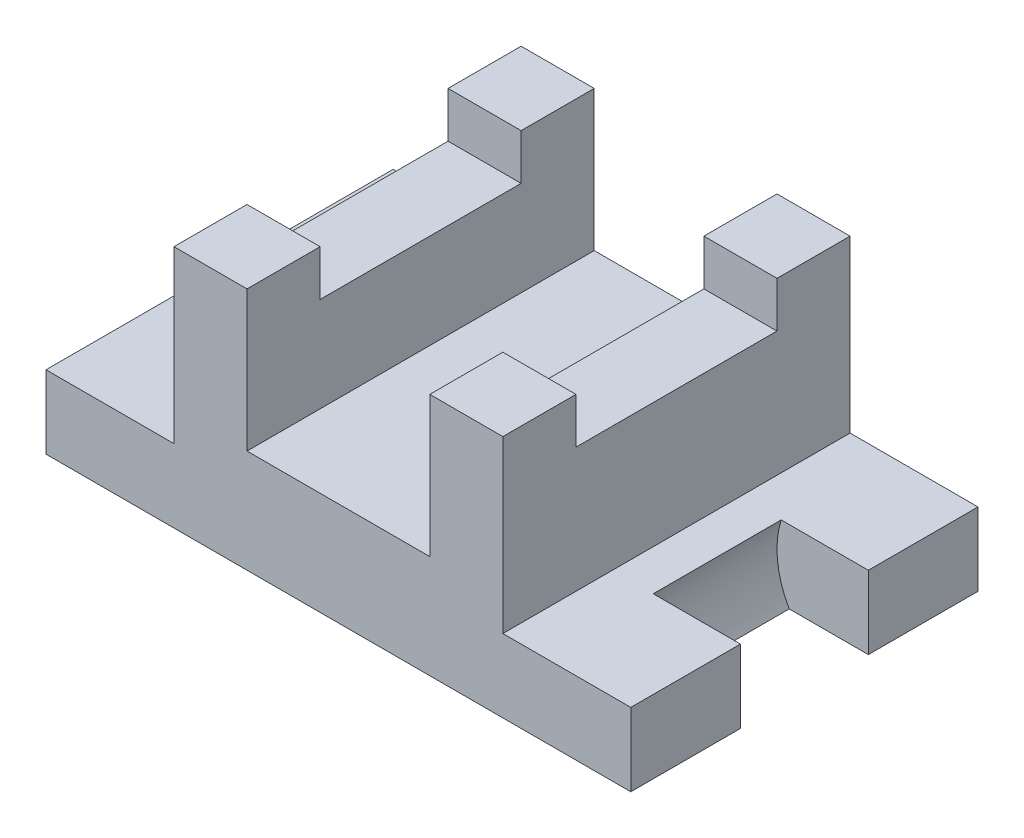
ISO-10303-21;
HEADER;
FILE_DESCRIPTION(('STEP AP214'),'2;1');
FILE_NAME('part.step','',(''),(''),'','','');
FILE_SCHEMA(('AUTOMOTIVE_DESIGN { 1 0 10303 214 1 1 1 1 }'));
ENDSEC;
DATA;
#1=APPLICATION_CONTEXT('core data for automotive mechanical design processes');
#2=APPLICATION_PROTOCOL_DEFINITION('international standard','automotive_design',2000,#1);
#3=PRODUCT_CONTEXT('',#1,'mechanical');
#4=PRODUCT('Part','Part','',(#3));
#5=PRODUCT_RELATED_PRODUCT_CATEGORY('part','',(#4));
#6=PRODUCT_DEFINITION_FORMATION('','',#4);
#7=PRODUCT_DEFINITION_CONTEXT('part definition',#1,'design');
#8=PRODUCT_DEFINITION('design','',#6,#7);
#9=PRODUCT_DEFINITION_SHAPE('','',#8);
#10=(LENGTH_UNIT() NAMED_UNIT(*) SI_UNIT(.MILLI.,.METRE.));
#11=(NAMED_UNIT(*) PLANE_ANGLE_UNIT() SI_UNIT($,.RADIAN.));
#12=(NAMED_UNIT(*) SI_UNIT($,.STERADIAN.) SOLID_ANGLE_UNIT());
#13=UNCERTAINTY_MEASURE_WITH_UNIT(LENGTH_MEASURE(1.E-05),#10,'distance_accuracy_value','');
#14=(GEOMETRIC_REPRESENTATION_CONTEXT(3) GLOBAL_UNCERTAINTY_ASSIGNED_CONTEXT((#13)) GLOBAL_UNIT_ASSIGNED_CONTEXT((#10,
#11,#12)) REPRESENTATION_CONTEXT('',''));
#15=CARTESIAN_POINT('',(0.,0.,0.));
#16=DIRECTION('',(0.,0.,1.));
#17=DIRECTION('',(1.,0.,0.));
#18=AXIS2_PLACEMENT_3D('',#15,#16,#17);
#19=CARTESIAN_POINT('',(-17.9522074080151,14.406673628607,38.));
#20=DIRECTION('',(0.,1.,0.));
#21=DIRECTION('',(0.,0.,1.));
#22=AXIS2_PLACEMENT_3D('',#19,#20,#21);
#23=PLANE('',#22);
#24=DIRECTION('',(1.,0.,0.));
#25=VECTOR('',#24,1.);
#26=CARTESIAN_POINT('',(-17.9522074080151,14.406673628607,12.));
#27=LINE('',#26,#25);
#28=CARTESIAN_POINT('',(37.3875385541405,14.406673628607,12.));
#29=VERTEX_POINT('',#28);
#30=CARTESIAN_POINT('',(46.0477925919849,14.406673628607,12.));
#31=VERTEX_POINT('',#30);
#32=EDGE_CURVE('E211',#29,#31,#27,.T.);
#33=ORIENTED_EDGE('',*,*,#32,.F.);
#34=DIRECTION('',(0.,0.,-1.));
#35=VECTOR('',#34,1.);
#36=CARTESIAN_POINT('',(37.3875385541405,14.406673628607,12.));
#37=LINE('',#36,#35);
#38=CARTESIAN_POINT('',(37.3875385541405,14.406673628607,26.));
#39=VERTEX_POINT('',#38);
#40=EDGE_CURVE('E199',#29,#39,#37,.F.);
#41=ORIENTED_EDGE('',*,*,#40,.T.);
#42=DIRECTION('',(1.,0.,0.));
#43=VECTOR('',#42,1.);
#44=CARTESIAN_POINT('',(-17.9522074080151,14.406673628607,26.));
#45=LINE('',#44,#43);
#46=CARTESIAN_POINT('',(46.0477925919849,14.406673628607,26.));
#47=VERTEX_POINT('',#46);
#48=EDGE_CURVE('E191',#39,#47,#45,.T.);
#49=ORIENTED_EDGE('',*,*,#48,.T.);
#50=DIRECTION('',(0.,0.,-1.));
#51=VECTOR('',#50,1.);
#52=CARTESIAN_POINT('',(46.0477925919849,14.406673628607,38.));
#53=LINE('',#52,#51);
#54=CARTESIAN_POINT('',(46.0477925919849,14.406673628607,38.));
#55=VERTEX_POINT('',#54);
#56=EDGE_CURVE('E338',#55,#47,#53,.T.);
#57=ORIENTED_EDGE('',*,*,#56,.F.);
#58=DIRECTION('',(1.,0.,0.));
#59=VECTOR('',#58,1.);
#60=CARTESIAN_POINT('',(-17.9522074080151,14.406673628607,38.));
#61=LINE('',#60,#59);
#62=CARTESIAN_POINT('',(-17.9522074080151,14.406673628607,38.));
#63=VERTEX_POINT('',#62);
#64=EDGE_CURVE('E274',#63,#55,#61,.T.);
#65=ORIENTED_EDGE('',*,*,#64,.F.);
#66=DIRECTION('',(0.,0.,-1.));
#67=VECTOR('',#66,1.);
#68=CARTESIAN_POINT('',(-17.9522074080151,14.406673628607,38.));
#69=LINE('',#68,#67);
#70=CARTESIAN_POINT('',(-17.9522074080151,14.406673628607,0.));
#71=VERTEX_POINT('',#70);
#72=EDGE_CURVE('E340',#63,#71,#69,.T.);
#73=ORIENTED_EDGE('',*,*,#72,.T.);
#74=DIRECTION('',(1.,0.,0.));
#75=VECTOR('',#74,1.);
#76=CARTESIAN_POINT('',(-17.9522074080151,14.406673628607,0.));
#77=LINE('',#76,#75);
#78=CARTESIAN_POINT('',(46.0477925919849,14.406673628607,0.));
#79=VERTEX_POINT('',#78);
#80=EDGE_CURVE('E300',#71,#79,#77,.T.);
#81=ORIENTED_EDGE('',*,*,#80,.T.);
#82=EDGE_CURVE('E337',#31,#79,#53,.T.);
#83=ORIENTED_EDGE('',*,*,#82,.F.);
#84=EDGE_LOOP('',(#33,#41,#49,#57,#65,#73,#81,#83));
#85=FACE_BOUND('',#84,.T.);
#86=ADVANCED_FACE('F33',(#85),#23,.F.);
#87=CARTESIAN_POINT('',(46.0477925919849,14.406673628607,38.));
#88=DIRECTION('',(-1.,0.,0.));
#89=DIRECTION('',(0.,0.,1.));
#90=AXIS2_PLACEMENT_3D('',#87,#88,#89);
#91=PLANE('',#90);
#92=DIRECTION('',(0.,1.,0.));
#93=VECTOR('',#92,1.);
#94=CARTESIAN_POINT('',(46.0477925919849,14.406673628607,12.));
#95=LINE('',#94,#93);
#96=CARTESIAN_POINT('',(46.0477925919849,22.406673628607,12.));
#97=VERTEX_POINT('',#96);
#98=EDGE_CURVE('E212',#31,#97,#95,.T.);
#99=ORIENTED_EDGE('',*,*,#98,.F.);
#100=ORIENTED_EDGE('',*,*,#82,.T.);
#101=DIRECTION('',(0.,1.,0.));
#102=VECTOR('',#101,1.);
#103=CARTESIAN_POINT('',(46.0477925919849,14.406673628607,0.));
#104=LINE('',#103,#102);
#105=CARTESIAN_POINT('',(46.0477925919849,22.406673628607,0.));
#106=VERTEX_POINT('',#105);
#107=EDGE_CURVE('E303',#79,#106,#104,.T.);
#108=ORIENTED_EDGE('',*,*,#107,.T.);
#109=DIRECTION('',(0.,0.,-1.));
#110=VECTOR('',#109,1.);
#111=CARTESIAN_POINT('',(46.0477925919849,22.406673628607,38.));
#112=LINE('',#111,#110);
#113=EDGE_CURVE('E333',#97,#106,#112,.T.);
#114=ORIENTED_EDGE('',*,*,#113,.F.);
#115=EDGE_LOOP('',(#99,#100,#108,#114));
#116=FACE_BOUND('',#115,.T.);
#117=ADVANCED_FACE('F381',(#116),#91,.F.);
#118=CARTESIAN_POINT('',(46.0477925919849,22.406673628607,38.));
#119=DIRECTION('',(0.,-1.,0.));
#120=DIRECTION('',(0.,0.,-1.));
#121=AXIS2_PLACEMENT_3D('',#118,#119,#120);
#122=PLANE('',#121);
#123=DIRECTION('',(-1.,0.,0.));
#124=VECTOR('',#123,1.);
#125=CARTESIAN_POINT('',(46.0477925919849,22.406673628607,12.));
#126=LINE('',#125,#124);
#127=CARTESIAN_POINT('',(36.5084005778155,22.406673628607,12.));
#128=VERTEX_POINT('',#127);
#129=EDGE_CURVE('E11',#97,#128,#126,.T.);
#130=ORIENTED_EDGE('',*,*,#129,.F.);
#131=ORIENTED_EDGE('',*,*,#113,.T.);
#132=DIRECTION('',(-1.,0.,0.));
#133=VECTOR('',#132,1.);
#134=CARTESIAN_POINT('',(46.0477925919849,22.406673628607,0.));
#135=LINE('',#134,#133);
#136=CARTESIAN_POINT('',(32.0477925919849,22.406673628607,0.));
#137=VERTEX_POINT('',#136);
#138=EDGE_CURVE('E306',#106,#137,#135,.T.);
#139=ORIENTED_EDGE('',*,*,#138,.T.);
#140=DIRECTION('',(0.,0.,-1.));
#141=VECTOR('',#140,1.);
#142=CARTESIAN_POINT('',(32.0477925919849,22.406673628607,38.));
#143=LINE('',#142,#141);
#144=CARTESIAN_POINT('',(32.0477925919849,22.406673628607,38.));
#145=VERTEX_POINT('',#144);
#146=EDGE_CURVE('E330',#145,#137,#143,.T.);
#147=ORIENTED_EDGE('',*,*,#146,.F.);
#148=DIRECTION('',(-1.,0.,0.));
#149=VECTOR('',#148,1.);
#150=CARTESIAN_POINT('',(46.0477925919849,22.406673628607,38.));
#151=LINE('',#150,#149);
#152=CARTESIAN_POINT('',(46.0477925919849,22.406673628607,38.));
#153=VERTEX_POINT('',#152);
#154=EDGE_CURVE('E278',#153,#145,#151,.T.);
#155=ORIENTED_EDGE('',*,*,#154,.F.);
#156=CARTESIAN_POINT('',(46.0477925919849,22.406673628607,26.));
#157=VERTEX_POINT('',#156);
#158=EDGE_CURVE('E334',#153,#157,#112,.T.);
#159=ORIENTED_EDGE('',*,*,#158,.T.);
#160=DIRECTION('',(-1.,0.,0.));
#161=VECTOR('',#160,1.);
#162=CARTESIAN_POINT('',(46.0477925919849,22.406673628607,26.));
#163=LINE('',#162,#161);
#164=CARTESIAN_POINT('',(36.5084005778155,22.406673628607,26.));
#165=VERTEX_POINT('',#164);
#166=EDGE_CURVE('E366',#157,#165,#163,.T.);
#167=ORIENTED_EDGE('',*,*,#166,.T.);
#168=DIRECTION('',(0.,0.,-1.));
#169=VECTOR('',#168,1.);
#170=CARTESIAN_POINT('',(36.5084005778155,22.406673628607,12.));
#171=LINE('',#170,#169);
#172=EDGE_CURVE('E41',#165,#128,#171,.T.);
#173=ORIENTED_EDGE('',*,*,#172,.T.);
#174=EDGE_LOOP('',(#130,#131,#139,#147,#155,#159,#167,#173));
#175=FACE_BOUND('',#174,.T.);
#176=ADVANCED_FACE('F369',(#175),#122,.F.);
#177=CARTESIAN_POINT('',(4.04779259198493,41.0733402952737,38.));
#178=DIRECTION('',(0.,-1.,0.));
#179=DIRECTION('',(0.,0.,-1.));
#180=AXIS2_PLACEMENT_3D('',#177,#178,#179);
#181=PLANE('',#180);
#182=DIRECTION('',(0.,0.,-1.));
#183=VECTOR('',#182,1.);
#184=CARTESIAN_POINT('',(-3.95220740801507,41.0733402952737,38.));
#185=LINE('',#184,#183);
#186=CARTESIAN_POINT('',(-3.95220740801507,41.0733402952737,8.));
#187=VERTEX_POINT('',#186);
#188=CARTESIAN_POINT('',(-3.95220740801507,41.0733402952737,0.));
#189=VERTEX_POINT('',#188);
#190=EDGE_CURVE('E349',#187,#189,#185,.T.);
#191=ORIENTED_EDGE('',*,*,#190,.F.);
#192=DIRECTION('',(1.,0.,0.));
#193=VECTOR('',#192,1.);
#194=CARTESIAN_POINT('',(4.04779259198493,41.0733402952737,8.));
#195=LINE('',#194,#193);
#196=CARTESIAN_POINT('',(4.04779259198493,41.0733402952737,8.));
#197=VERTEX_POINT('',#196);
#198=EDGE_CURVE('E255',#187,#197,#195,.T.);
#199=ORIENTED_EDGE('',*,*,#198,.T.);
#200=DIRECTION('',(0.,0.,-1.));
#201=VECTOR('',#200,1.);
#202=CARTESIAN_POINT('',(4.04779259198493,41.0733402952737,38.));
#203=LINE('',#202,#201);
#204=CARTESIAN_POINT('',(4.04779259198493,41.0733402952737,0.));
#205=VERTEX_POINT('',#204);
#206=EDGE_CURVE('E353',#197,#205,#203,.T.);
#207=ORIENTED_EDGE('',*,*,#206,.T.);
#208=DIRECTION('',(-1.,0.,0.));
#209=VECTOR('',#208,1.);
#210=CARTESIAN_POINT('',(4.04779259198493,41.0733402952737,0.));
#211=LINE('',#210,#209);
#212=EDGE_CURVE('E291',#205,#189,#211,.T.);
#213=ORIENTED_EDGE('',*,*,#212,.T.);
#214=EDGE_LOOP('',(#191,#199,#207,#213));
#215=FACE_BOUND('',#214,.T.);
#216=ADVANCED_FACE('F420',(#215),#181,.F.);
#217=CARTESIAN_POINT('',(32.0477925919849,41.0733402952737,38.));
#218=DIRECTION('',(0.,-1.,0.));
#219=DIRECTION('',(0.,0.,-1.));
#220=AXIS2_PLACEMENT_3D('',#217,#218,#219);
#221=PLANE('',#220);
#222=DIRECTION('',(0.,0.,-1.));
#223=VECTOR('',#222,1.);
#224=CARTESIAN_POINT('',(24.0477925919849,41.0733402952737,38.));
#225=LINE('',#224,#223);
#226=CARTESIAN_POINT('',(24.0477925919849,41.0733402952737,8.));
#227=VERTEX_POINT('',#226);
#228=CARTESIAN_POINT('',(24.0477925919849,41.0733402952737,0.));
#229=VERTEX_POINT('',#228);
#230=EDGE_CURVE('E322',#227,#229,#225,.T.);
#231=ORIENTED_EDGE('',*,*,#230,.F.);
#232=DIRECTION('',(1.,0.,0.));
#233=VECTOR('',#232,1.);
#234=CARTESIAN_POINT('',(32.0477925919849,41.0733402952737,8.));
#235=LINE('',#234,#233);
#236=CARTESIAN_POINT('',(32.0477925919849,41.0733402952737,8.));
#237=VERTEX_POINT('',#236);
#238=EDGE_CURVE('E249',#227,#237,#235,.T.);
#239=ORIENTED_EDGE('',*,*,#238,.T.);
#240=DIRECTION('',(0.,0.,-1.));
#241=VECTOR('',#240,1.);
#242=CARTESIAN_POINT('',(32.0477925919849,41.0733402952737,38.));
#243=LINE('',#242,#241);
#244=CARTESIAN_POINT('',(32.0477925919849,41.0733402952737,0.));
#245=VERTEX_POINT('',#244);
#246=EDGE_CURVE('E326',#237,#245,#243,.T.);
#247=ORIENTED_EDGE('',*,*,#246,.T.);
#248=DIRECTION('',(-1.,0.,0.));
#249=VECTOR('',#248,1.);
#250=CARTESIAN_POINT('',(32.0477925919849,41.0733402952737,0.));
#251=LINE('',#250,#249);
#252=EDGE_CURVE('E311',#245,#229,#251,.T.);
#253=ORIENTED_EDGE('',*,*,#252,.T.);
#254=EDGE_LOOP('',(#231,#239,#247,#253));
#255=FACE_BOUND('',#254,.T.);
#256=ADVANCED_FACE('F437',(#255),#221,.F.);
#257=CARTESIAN_POINT('',(4.04779259198493,41.0733402952737,38.));
#258=DIRECTION('',(-1.,0.,0.));
#259=DIRECTION('',(0.,0.,1.));
#260=AXIS2_PLACEMENT_3D('',#257,#258,#259);
#261=PLANE('',#260);
#262=ORIENTED_EDGE('',*,*,#206,.F.);
#263=DIRECTION('',(0.,-1.,0.));
#264=VECTOR('',#263,1.);
#265=CARTESIAN_POINT('',(4.04779259198493,41.0733402952737,8.));
#266=LINE('',#265,#264);
#267=CARTESIAN_POINT('',(4.04779259198493,36.0733402952737,8.));
#268=VERTEX_POINT('',#267);
#269=EDGE_CURVE('E258',#197,#268,#266,.T.);
#270=ORIENTED_EDGE('',*,*,#269,.T.);
#271=DIRECTION('',(0.,0.,1.));
#272=VECTOR('',#271,1.);
#273=CARTESIAN_POINT('',(4.04779259198493,36.0733402952737,38.));
#274=LINE('',#273,#272);
#275=CARTESIAN_POINT('',(4.04779259198493,36.0733402952737,30.));
#276=VERTEX_POINT('',#275);
#277=EDGE_CURVE('E246',#268,#276,#274,.T.);
#278=ORIENTED_EDGE('',*,*,#277,.T.);
#279=DIRECTION('',(0.,1.,0.));
#280=VECTOR('',#279,1.);
#281=CARTESIAN_POINT('',(4.04779259198493,41.0733402952737,30.));
#282=LINE('',#281,#280);
#283=CARTESIAN_POINT('',(4.04779259198493,41.0733402952737,30.));
#284=VERTEX_POINT('',#283);
#285=EDGE_CURVE('E240',#276,#284,#282,.T.);
#286=ORIENTED_EDGE('',*,*,#285,.T.);
#287=CARTESIAN_POINT('',(4.04779259198493,41.0733402952737,38.));
#288=VERTEX_POINT('',#287);
#289=EDGE_CURVE('E354',#288,#284,#203,.T.);
#290=ORIENTED_EDGE('',*,*,#289,.F.);
#291=DIRECTION('',(0.,1.,0.));
#292=VECTOR('',#291,1.);
#293=CARTESIAN_POINT('',(4.04779259198493,41.0733402952737,38.));
#294=LINE('',#293,#292);
#295=CARTESIAN_POINT('',(4.04779259198493,25.7007912756659,38.));
#296=VERTEX_POINT('',#295);
#297=EDGE_CURVE('E262',#296,#288,#294,.T.);
#298=ORIENTED_EDGE('',*,*,#297,.F.);
#299=DIRECTION('',(0.,0.,-1.));
#300=VECTOR('',#299,1.);
#301=CARTESIAN_POINT('',(4.04779259198493,25.7007912756659,38.));
#302=LINE('',#301,#300);
#303=CARTESIAN_POINT('',(4.04779259198493,25.7007912756659,0.));
#304=VERTEX_POINT('',#303);
#305=EDGE_CURVE('E288',#296,#304,#302,.T.);
#306=ORIENTED_EDGE('',*,*,#305,.T.);
#307=DIRECTION('',(0.,1.,0.));
#308=VECTOR('',#307,1.);
#309=CARTESIAN_POINT('',(4.04779259198493,41.0733402952737,0.));
#310=LINE('',#309,#308);
#311=EDGE_CURVE('E261',#304,#205,#310,.T.);
#312=ORIENTED_EDGE('',*,*,#311,.T.);
#313=EDGE_LOOP('',(#262,#270,#278,#286,#290,#298,#306,#312));
#314=FACE_BOUND('',#313,.T.);
#315=ADVANCED_FACE('F35',(#314),#261,.F.);
#316=ORIENTED_EDGE('',*,*,#289,.T.);
#317=DIRECTION('',(-1.,0.,0.));
#318=VECTOR('',#317,1.);
#319=CARTESIAN_POINT('',(4.04779259198493,41.0733402952737,30.));
#320=LINE('',#319,#318);
#321=CARTESIAN_POINT('',(-3.95220740801507,41.0733402952737,30.));
#322=VERTEX_POINT('',#321);
#323=EDGE_CURVE('E237',#284,#322,#320,.T.);
#324=ORIENTED_EDGE('',*,*,#323,.T.);
#325=CARTESIAN_POINT('',(-3.95220740801507,41.0733402952737,38.));
#326=VERTEX_POINT('',#325);
#327=EDGE_CURVE('E350',#326,#322,#185,.T.);
#328=ORIENTED_EDGE('',*,*,#327,.F.);
#329=DIRECTION('',(-1.,0.,0.));
#330=VECTOR('',#329,1.);
#331=CARTESIAN_POINT('',(4.04779259198493,41.0733402952737,38.));
#332=LINE('',#331,#330);
#333=EDGE_CURVE('E265',#288,#326,#332,.T.);
#334=ORIENTED_EDGE('',*,*,#333,.F.);
#335=EDGE_LOOP('',(#316,#324,#328,#334));
#336=FACE_BOUND('',#335,.T.);
#337=ADVANCED_FACE('F452',(#336),#181,.F.);
#338=CARTESIAN_POINT('',(-3.95220740801507,41.0733402952737,38.));
#339=DIRECTION('',(1.,0.,0.));
#340=DIRECTION('',(0.,0.,-1.));
#341=AXIS2_PLACEMENT_3D('',#338,#339,#340);
#342=PLANE('',#341);
#343=DIRECTION('',(0.,0.,-1.));
#344=VECTOR('',#343,1.);
#345=CARTESIAN_POINT('',(-3.95220740801507,36.0733402952737,38.));
#346=LINE('',#345,#344);
#347=CARTESIAN_POINT('',(-3.95220740801507,36.0733402952737,30.));
#348=VERTEX_POINT('',#347);
#349=CARTESIAN_POINT('',(-3.95220740801507,36.0733402952737,8.));
#350=VERTEX_POINT('',#349);
#351=EDGE_CURVE('E243',#348,#350,#346,.T.);
#352=ORIENTED_EDGE('',*,*,#351,.T.);
#353=DIRECTION('',(0.,1.,0.));
#354=VECTOR('',#353,1.);
#355=CARTESIAN_POINT('',(-3.95220740801507,41.0733402952737,8.));
#356=LINE('',#355,#354);
#357=EDGE_CURVE('E252',#350,#187,#356,.T.);
#358=ORIENTED_EDGE('',*,*,#357,.T.);
#359=ORIENTED_EDGE('',*,*,#190,.T.);
#360=DIRECTION('',(0.,-1.,0.));
#361=VECTOR('',#360,1.);
#362=CARTESIAN_POINT('',(-3.95220740801507,41.0733402952737,0.));
#363=LINE('',#362,#361);
#364=CARTESIAN_POINT('',(-3.95220740801507,22.406673628607,0.));
#365=VERTEX_POINT('',#364);
#366=EDGE_CURVE('E294',#189,#365,#363,.T.);
#367=ORIENTED_EDGE('',*,*,#366,.T.);
#368=DIRECTION('',(0.,0.,-1.));
#369=VECTOR('',#368,1.);
#370=CARTESIAN_POINT('',(-3.95220740801507,22.406673628607,38.));
#371=LINE('',#370,#369);
#372=CARTESIAN_POINT('',(-3.95220740801507,22.406673628607,38.));
#373=VERTEX_POINT('',#372);
#374=EDGE_CURVE('E346',#373,#365,#371,.T.);
#375=ORIENTED_EDGE('',*,*,#374,.F.);
#376=DIRECTION('',(0.,-1.,0.));
#377=VECTOR('',#376,1.);
#378=CARTESIAN_POINT('',(-3.95220740801507,41.0733402952737,38.));
#379=LINE('',#378,#377);
#380=EDGE_CURVE('E268',#326,#373,#379,.T.);
#381=ORIENTED_EDGE('',*,*,#380,.F.);
#382=ORIENTED_EDGE('',*,*,#327,.T.);
#383=DIRECTION('',(0.,-1.,0.));
#384=VECTOR('',#383,1.);
#385=CARTESIAN_POINT('',(-3.95220740801507,41.0733402952737,30.));
#386=LINE('',#385,#384);
#387=EDGE_CURVE('E234',#322,#348,#386,.T.);
#388=ORIENTED_EDGE('',*,*,#387,.T.);
#389=EDGE_LOOP('',(#352,#358,#359,#367,#375,#381,#382,#388));
#390=FACE_BOUND('',#389,.T.);
#391=ADVANCED_FACE('F417',(#390),#342,.F.);
#392=CARTESIAN_POINT('',(-3.95220740801507,22.406673628607,38.));
#393=DIRECTION('',(0.,-1.,0.));
#394=DIRECTION('',(0.,0.,-1.));
#395=AXIS2_PLACEMENT_3D('',#392,#393,#394);
#396=PLANE('',#395);
#397=DIRECTION('',(-1.,0.,0.));
#398=VECTOR('',#397,1.);
#399=CARTESIAN_POINT('',(-3.95220740801507,22.406673628607,0.));
#400=LINE('',#399,#398);
#401=CARTESIAN_POINT('',(-17.9522074080151,22.406673628607,0.));
#402=VERTEX_POINT('',#401);
#403=EDGE_CURVE('E296',#365,#402,#400,.T.);
#404=ORIENTED_EDGE('',*,*,#403,.T.);
#405=DIRECTION('',(0.,0.,-1.));
#406=VECTOR('',#405,1.);
#407=CARTESIAN_POINT('',(-17.9522074080151,22.406673628607,38.));
#408=LINE('',#407,#406);
#409=CARTESIAN_POINT('',(-17.9522074080151,22.406673628607,38.));
#410=VERTEX_POINT('',#409);
#411=EDGE_CURVE('E343',#410,#402,#408,.T.);
#412=ORIENTED_EDGE('',*,*,#411,.F.);
#413=DIRECTION('',(-1.,0.,0.));
#414=VECTOR('',#413,1.);
#415=CARTESIAN_POINT('',(-3.95220740801507,22.406673628607,38.));
#416=LINE('',#415,#414);
#417=EDGE_CURVE('E270',#373,#410,#416,.T.);
#418=ORIENTED_EDGE('',*,*,#417,.F.);
#419=ORIENTED_EDGE('',*,*,#374,.T.);
#420=EDGE_LOOP('',(#404,#412,#418,#419));
#421=FACE_BOUND('',#420,.T.);
#422=ADVANCED_FACE('F413',(#421),#396,.F.);
#423=CARTESIAN_POINT('',(-17.9522074080151,22.406673628607,38.));
#424=DIRECTION('',(1.,0.,0.));
#425=DIRECTION('',(0.,1.,0.));
#426=AXIS2_PLACEMENT_3D('',#423,#424,#425);
#427=PLANE('',#426);
#428=DIRECTION('',(0.,-1.,0.));
#429=VECTOR('',#428,1.);
#430=CARTESIAN_POINT('',(-17.9522074080151,22.406673628607,0.));
#431=LINE('',#430,#429);
#432=EDGE_CURVE('E298',#402,#71,#431,.T.);
#433=ORIENTED_EDGE('',*,*,#432,.T.);
#434=ORIENTED_EDGE('',*,*,#72,.F.);
#435=DIRECTION('',(0.,-1.,0.));
#436=VECTOR('',#435,1.);
#437=CARTESIAN_POINT('',(-17.9522074080151,22.406673628607,38.));
#438=LINE('',#437,#436);
#439=EDGE_CURVE('E272',#410,#63,#438,.T.);
#440=ORIENTED_EDGE('',*,*,#439,.F.);
#441=ORIENTED_EDGE('',*,*,#411,.T.);
#442=EDGE_LOOP('',(#433,#434,#440,#441));
#443=FACE_BOUND('',#442,.T.);
#444=ADVANCED_FACE('F408',(#443),#427,.F.);
#445=ORIENTED_EDGE('',*,*,#56,.T.);
#446=DIRECTION('',(0.,1.,0.));
#447=VECTOR('',#446,1.);
#448=CARTESIAN_POINT('',(46.0477925919849,14.406673628607,26.));
#449=LINE('',#448,#447);
#450=EDGE_CURVE('E194',#47,#157,#449,.T.);
#451=ORIENTED_EDGE('',*,*,#450,.T.);
#452=ORIENTED_EDGE('',*,*,#158,.F.);
#453=DIRECTION('',(0.,1.,0.));
#454=VECTOR('',#453,1.);
#455=CARTESIAN_POINT('',(46.0477925919849,14.406673628607,38.));
#456=LINE('',#455,#454);
#457=EDGE_CURVE('E276',#55,#153,#456,.T.);
#458=ORIENTED_EDGE('',*,*,#457,.F.);
#459=EDGE_LOOP('',(#445,#451,#452,#458));
#460=FACE_BOUND('',#459,.T.);
#461=ADVANCED_FACE('F374',(#460),#91,.F.);
#462=CARTESIAN_POINT('',(32.0477925919849,22.406673628607,38.));
#463=DIRECTION('',(-1.,0.,0.));
#464=DIRECTION('',(0.,0.,1.));
#465=AXIS2_PLACEMENT_3D('',#462,#463,#464);
#466=PLANE('',#465);
#467=ORIENTED_EDGE('',*,*,#246,.F.);
#468=DIRECTION('',(0.,1.,0.));
#469=VECTOR('',#468,1.);
#470=CARTESIAN_POINT('',(32.0477925919849,46.0733402952737,8.));
#471=LINE('',#470,#469);
#472=CARTESIAN_POINT('',(32.0477925919849,36.0733402952737,8.));
#473=VERTEX_POINT('',#472);
#474=EDGE_CURVE('E218',#473,#237,#471,.T.);
#475=ORIENTED_EDGE('',*,*,#474,.F.);
#476=DIRECTION('',(0.,0.,-1.));
#477=VECTOR('',#476,1.);
#478=CARTESIAN_POINT('',(32.0477925919849,36.0733402952737,30.));
#479=LINE('',#478,#477);
#480=CARTESIAN_POINT('',(32.0477925919849,36.0733402952737,30.));
#481=VERTEX_POINT('',#480);
#482=EDGE_CURVE('E223',#481,#473,#479,.T.);
#483=ORIENTED_EDGE('',*,*,#482,.F.);
#484=DIRECTION('',(0.,-1.,0.));
#485=VECTOR('',#484,1.);
#486=CARTESIAN_POINT('',(32.0477925919849,46.0733402952737,30.));
#487=LINE('',#486,#485);
#488=CARTESIAN_POINT('',(32.0477925919849,41.0733402952737,30.));
#489=VERTEX_POINT('',#488);
#490=EDGE_CURVE('E220',#489,#481,#487,.T.);
#491=ORIENTED_EDGE('',*,*,#490,.F.);
#492=CARTESIAN_POINT('',(32.0477925919849,41.0733402952737,38.));
#493=VERTEX_POINT('',#492);
#494=EDGE_CURVE('E327',#493,#489,#243,.T.);
#495=ORIENTED_EDGE('',*,*,#494,.F.);
#496=DIRECTION('',(0.,1.,0.));
#497=VECTOR('',#496,1.);
#498=CARTESIAN_POINT('',(32.0477925919849,22.406673628607,38.));
#499=LINE('',#498,#497);
#500=EDGE_CURVE('E280',#145,#493,#499,.T.);
#501=ORIENTED_EDGE('',*,*,#500,.F.);
#502=ORIENTED_EDGE('',*,*,#146,.T.);
#503=DIRECTION('',(0.,1.,0.));
#504=VECTOR('',#503,1.);
#505=CARTESIAN_POINT('',(32.0477925919849,22.406673628607,0.));
#506=LINE('',#505,#504);
#507=EDGE_CURVE('E308',#137,#245,#506,.T.);
#508=ORIENTED_EDGE('',*,*,#507,.T.);
#509=EDGE_LOOP('',(#467,#475,#483,#491,#495,#501,#502,#508));
#510=FACE_BOUND('',#509,.T.);
#511=ADVANCED_FACE('F397',(#510),#466,.F.);
#512=ORIENTED_EDGE('',*,*,#494,.T.);
#513=DIRECTION('',(-1.,0.,0.));
#514=VECTOR('',#513,1.);
#515=CARTESIAN_POINT('',(32.0477925919849,41.0733402952737,30.));
#516=LINE('',#515,#514);
#517=CARTESIAN_POINT('',(24.0477925919849,41.0733402952737,30.));
#518=VERTEX_POINT('',#517);
#519=EDGE_CURVE('E231',#489,#518,#516,.T.);
#520=ORIENTED_EDGE('',*,*,#519,.T.);
#521=CARTESIAN_POINT('',(24.0477925919849,41.0733402952737,38.));
#522=VERTEX_POINT('',#521);
#523=EDGE_CURVE('E323',#522,#518,#225,.T.);
#524=ORIENTED_EDGE('',*,*,#523,.F.);
#525=DIRECTION('',(-1.,0.,0.));
#526=VECTOR('',#525,1.);
#527=CARTESIAN_POINT('',(32.0477925919849,41.0733402952737,38.));
#528=LINE('',#527,#526);
#529=EDGE_CURVE('E282',#493,#522,#528,.T.);
#530=ORIENTED_EDGE('',*,*,#529,.F.);
#531=EDGE_LOOP('',(#512,#520,#524,#530));
#532=FACE_BOUND('',#531,.T.);
#533=ADVANCED_FACE('F449',(#532),#221,.F.);
#534=CARTESIAN_POINT('',(24.0477925919849,41.0733402952737,38.));
#535=DIRECTION('',(1.,0.,0.));
#536=DIRECTION('',(0.,0.,-1.));
#537=AXIS2_PLACEMENT_3D('',#534,#535,#536);
#538=PLANE('',#537);
#539=DIRECTION('',(0.,0.,-1.));
#540=VECTOR('',#539,1.);
#541=CARTESIAN_POINT('',(24.0477925919849,36.0733402952737,38.));
#542=LINE('',#541,#540);
#543=CARTESIAN_POINT('',(24.0477925919849,36.0733402952737,30.));
#544=VERTEX_POINT('',#543);
#545=CARTESIAN_POINT('',(24.0477925919849,36.0733402952737,8.));
#546=VERTEX_POINT('',#545);
#547=EDGE_CURVE('E360',#544,#546,#542,.T.);
#548=ORIENTED_EDGE('',*,*,#547,.T.);
#549=DIRECTION('',(0.,1.,0.));
#550=VECTOR('',#549,1.);
#551=CARTESIAN_POINT('',(24.0477925919849,41.0733402952737,8.));
#552=LINE('',#551,#550);
#553=EDGE_CURVE('E363',#546,#227,#552,.T.);
#554=ORIENTED_EDGE('',*,*,#553,.T.);
#555=ORIENTED_EDGE('',*,*,#230,.T.);
#556=DIRECTION('',(0.,-1.,0.));
#557=VECTOR('',#556,1.);
#558=CARTESIAN_POINT('',(24.0477925919849,41.0733402952737,0.));
#559=LINE('',#558,#557);
#560=CARTESIAN_POINT('',(24.0477925919849,25.7007912756659,0.));
#561=VERTEX_POINT('',#560);
#562=EDGE_CURVE('E314',#229,#561,#559,.T.);
#563=ORIENTED_EDGE('',*,*,#562,.T.);
#564=DIRECTION('',(0.,0.,-1.));
#565=VECTOR('',#564,1.);
#566=CARTESIAN_POINT('',(24.0477925919849,25.7007912756659,38.));
#567=LINE('',#566,#565);
#568=CARTESIAN_POINT('',(24.0477925919849,25.7007912756659,38.));
#569=VERTEX_POINT('',#568);
#570=EDGE_CURVE('E319',#569,#561,#567,.T.);
#571=ORIENTED_EDGE('',*,*,#570,.F.);
#572=DIRECTION('',(0.,-1.,0.));
#573=VECTOR('',#572,1.);
#574=CARTESIAN_POINT('',(24.0477925919849,41.0733402952737,38.));
#575=LINE('',#574,#573);
#576=EDGE_CURVE('E284',#522,#569,#575,.T.);
#577=ORIENTED_EDGE('',*,*,#576,.F.);
#578=ORIENTED_EDGE('',*,*,#523,.T.);
#579=DIRECTION('',(0.,-1.,0.));
#580=VECTOR('',#579,1.);
#581=CARTESIAN_POINT('',(24.0477925919849,41.0733402952737,30.));
#582=LINE('',#581,#580);
#583=EDGE_CURVE('E357',#518,#544,#582,.T.);
#584=ORIENTED_EDGE('',*,*,#583,.T.);
#585=EDGE_LOOP('',(#548,#554,#555,#563,#571,#577,#578,#584));
#586=FACE_BOUND('',#585,.T.);
#587=ADVANCED_FACE('F433',(#586),#538,.F.);
#588=CARTESIAN_POINT('',(4.04779259198493,25.7007912756659,38.));
#589=DIRECTION('',(0.,-1.,0.));
#590=DIRECTION('',(0.,0.,-1.));
#591=AXIS2_PLACEMENT_3D('',#588,#589,#590);
#592=PLANE('',#591);
#593=DIRECTION('',(-1.,0.,0.));
#594=VECTOR('',#593,1.);
#595=CARTESIAN_POINT('',(4.04779259198493,25.7007912756659,0.));
#596=LINE('',#595,#594);
#597=EDGE_CURVE('E266',#561,#304,#596,.T.);
#598=ORIENTED_EDGE('',*,*,#597,.T.);
#599=ORIENTED_EDGE('',*,*,#305,.F.);
#600=DIRECTION('',(-1.,0.,0.));
#601=VECTOR('',#600,1.);
#602=CARTESIAN_POINT('',(4.04779259198493,25.7007912756659,38.));
#603=LINE('',#602,#601);
#604=EDGE_CURVE('E286',#569,#296,#603,.T.);
#605=ORIENTED_EDGE('',*,*,#604,.F.);
#606=ORIENTED_EDGE('',*,*,#570,.T.);
#607=EDGE_LOOP('',(#598,#599,#605,#606));
#608=FACE_BOUND('',#607,.T.);
#609=ADVANCED_FACE('F429',(#608),#592,.F.);
#610=CARTESIAN_POINT('',(0.,0.,38.));
#611=DIRECTION('',(0.,0.,1.));
#612=DIRECTION('',(1.,0.,0.));
#613=AXIS2_PLACEMENT_3D('',#610,#611,#612);
#614=PLANE('',#613);
#615=ORIENTED_EDGE('',*,*,#297,.T.);
#616=ORIENTED_EDGE('',*,*,#333,.T.);
#617=ORIENTED_EDGE('',*,*,#380,.T.);
#618=ORIENTED_EDGE('',*,*,#417,.T.);
#619=ORIENTED_EDGE('',*,*,#439,.T.);
#620=ORIENTED_EDGE('',*,*,#64,.T.);
#621=ORIENTED_EDGE('',*,*,#457,.T.);
#622=ORIENTED_EDGE('',*,*,#154,.T.);
#623=ORIENTED_EDGE('',*,*,#500,.T.);
#624=ORIENTED_EDGE('',*,*,#529,.T.);
#625=ORIENTED_EDGE('',*,*,#576,.T.);
#626=ORIENTED_EDGE('',*,*,#604,.T.);
#627=EDGE_LOOP('',(#615,#616,#617,#618,#619,#620,#621,#622,#623,#624,#625,#626));
#628=FACE_BOUND('',#627,.T.);
#629=ADVANCED_FACE('F402',(#628),#614,.T.);
#630=CARTESIAN_POINT('',(0.,0.,0.));
#631=DIRECTION('',(0.,0.,1.));
#632=DIRECTION('',(1.,0.,0.));
#633=AXIS2_PLACEMENT_3D('',#630,#631,#632);
#634=PLANE('',#633);
#635=ORIENTED_EDGE('',*,*,#311,.F.);
#636=ORIENTED_EDGE('',*,*,#597,.F.);
#637=ORIENTED_EDGE('',*,*,#562,.F.);
#638=ORIENTED_EDGE('',*,*,#252,.F.);
#639=ORIENTED_EDGE('',*,*,#507,.F.);
#640=ORIENTED_EDGE('',*,*,#138,.F.);
#641=ORIENTED_EDGE('',*,*,#107,.F.);
#642=ORIENTED_EDGE('',*,*,#80,.F.);
#643=ORIENTED_EDGE('',*,*,#432,.F.);
#644=ORIENTED_EDGE('',*,*,#403,.F.);
#645=ORIENTED_EDGE('',*,*,#366,.F.);
#646=ORIENTED_EDGE('',*,*,#212,.F.);
#647=EDGE_LOOP('',(#635,#636,#637,#638,#639,#640,#641,#642,#643,#644,#645,#646));
#648=FACE_BOUND('',#647,.T.);
#649=ADVANCED_FACE('F390',(#648),#634,.F.);
#650=CARTESIAN_POINT('',(-17.9522074080151,46.0733402952737,30.));
#651=DIRECTION('',(0.,0.,1.));
#652=DIRECTION('',(1.,0.,0.));
#653=AXIS2_PLACEMENT_3D('',#650,#651,#652);
#654=PLANE('',#653);
#655=ORIENTED_EDGE('',*,*,#490,.T.);
#656=DIRECTION('',(1.,0.,0.));
#657=VECTOR('',#656,1.);
#658=CARTESIAN_POINT('',(-17.9522074080151,36.0733402952737,30.));
#659=LINE('',#658,#657);
#660=EDGE_CURVE('E226',#544,#481,#659,.T.);
#661=ORIENTED_EDGE('',*,*,#660,.F.);
#662=ORIENTED_EDGE('',*,*,#583,.F.);
#663=ORIENTED_EDGE('',*,*,#519,.F.);
#664=EDGE_LOOP('',(#655,#661,#662,#663));
#665=FACE_BOUND('',#664,.T.);
#666=ADVANCED_FACE('F447',(#665),#654,.F.);
#667=CARTESIAN_POINT('',(-17.9522074080151,36.0733402952737,30.));
#668=DIRECTION('',(0.,-1.,0.));
#669=DIRECTION('',(0.,0.,-1.));
#670=AXIS2_PLACEMENT_3D('',#667,#668,#669);
#671=PLANE('',#670);
#672=ORIENTED_EDGE('',*,*,#660,.T.);
#673=ORIENTED_EDGE('',*,*,#482,.T.);
#674=DIRECTION('',(1.,0.,0.));
#675=VECTOR('',#674,1.);
#676=CARTESIAN_POINT('',(-17.9522074080151,36.0733402952737,8.));
#677=LINE('',#676,#675);
#678=EDGE_CURVE('E227',#546,#473,#677,.T.);
#679=ORIENTED_EDGE('',*,*,#678,.F.);
#680=ORIENTED_EDGE('',*,*,#547,.F.);
#681=EDGE_LOOP('',(#672,#673,#679,#680));
#682=FACE_BOUND('',#681,.T.);
#683=ADVANCED_FACE('F445',(#682),#671,.F.);
#684=CARTESIAN_POINT('',(-17.9522074080151,46.0733402952737,8.));
#685=DIRECTION('',(0.,0.,-1.));
#686=DIRECTION('',(-1.,0.,0.));
#687=AXIS2_PLACEMENT_3D('',#684,#685,#686);
#688=PLANE('',#687);
#689=ORIENTED_EDGE('',*,*,#553,.F.);
#690=ORIENTED_EDGE('',*,*,#678,.T.);
#691=ORIENTED_EDGE('',*,*,#474,.T.);
#692=ORIENTED_EDGE('',*,*,#238,.F.);
#693=EDGE_LOOP('',(#689,#690,#691,#692));
#694=FACE_BOUND('',#693,.T.);
#695=ADVANCED_FACE('F441',(#694),#688,.F.);
#696=ORIENTED_EDGE('',*,*,#198,.F.);
#697=ORIENTED_EDGE('',*,*,#357,.F.);
#698=EDGE_CURVE('E229',#350,#268,#677,.T.);
#699=ORIENTED_EDGE('',*,*,#698,.T.);
#700=ORIENTED_EDGE('',*,*,#269,.F.);
#701=EDGE_LOOP('',(#696,#697,#699,#700));
#702=FACE_BOUND('',#701,.T.);
#703=ADVANCED_FACE('F459',(#702),#688,.F.);
#704=ORIENTED_EDGE('',*,*,#698,.F.);
#705=ORIENTED_EDGE('',*,*,#351,.F.);
#706=EDGE_CURVE('E56',#348,#276,#659,.T.);
#707=ORIENTED_EDGE('',*,*,#706,.T.);
#708=ORIENTED_EDGE('',*,*,#277,.F.);
#709=EDGE_LOOP('',(#704,#705,#707,#708));
#710=FACE_BOUND('',#709,.T.);
#711=ADVANCED_FACE('F456',(#710),#671,.F.);
#712=ORIENTED_EDGE('',*,*,#706,.F.);
#713=ORIENTED_EDGE('',*,*,#387,.F.);
#714=ORIENTED_EDGE('',*,*,#323,.F.);
#715=ORIENTED_EDGE('',*,*,#285,.F.);
#716=EDGE_LOOP('',(#712,#713,#714,#715));
#717=FACE_BOUND('',#716,.T.);
#718=ADVANCED_FACE('F453',(#717),#654,.F.);
#719=CARTESIAN_POINT('',(46.0477925919849,9.40667362860703,12.));
#720=DIRECTION('',(0.,0.,1.));
#721=DIRECTION('',(1.,0.,0.));
#722=AXIS2_PLACEMENT_3D('',#719,#720,#721);
#723=PLANE('',#722);
#724=ORIENTED_EDGE('',*,*,#32,.T.);
#725=ORIENTED_EDGE('',*,*,#98,.T.);
#726=ORIENTED_EDGE('',*,*,#129,.T.);
#727=CARTESIAN_POINT('',(46.0477925919849,19.406673628607,12.));
#728=DIRECTION('',(0.,0.,-1.));
#729=DIRECTION('',(-1.,0.,0.));
#730=AXIS2_PLACEMENT_3D('',#727,#728,#729);
#731=CIRCLE('',#730,10.);
#732=EDGE_CURVE('E207',#29,#128,#731,.T.);
#733=ORIENTED_EDGE('',*,*,#732,.F.);
#734=EDGE_LOOP('',(#724,#725,#726,#733));
#735=FACE_BOUND('',#734,.T.);
#736=ADVANCED_FACE('F378',(#735),#723,.T.);
#737=CARTESIAN_POINT('',(46.0477925919849,19.406673628607,12.));
#738=DIRECTION('',(0.,0.,-1.));
#739=DIRECTION('',(-1.,0.,0.));
#740=AXIS2_PLACEMENT_3D('',#737,#738,#739);
#741=CYLINDRICAL_SURFACE('',#740,10.);
#742=ORIENTED_EDGE('',*,*,#732,.T.);
#743=ORIENTED_EDGE('',*,*,#172,.F.);
#744=CARTESIAN_POINT('',(46.0477925919849,19.406673628607,26.));
#745=DIRECTION('',(0.,0.,-1.));
#746=DIRECTION('',(-1.,0.,0.));
#747=AXIS2_PLACEMENT_3D('',#744,#745,#746);
#748=CIRCLE('',#747,10.);
#749=EDGE_CURVE('E48',#39,#165,#748,.T.);
#750=ORIENTED_EDGE('',*,*,#749,.F.);
#751=ORIENTED_EDGE('',*,*,#40,.F.);
#752=EDGE_LOOP('',(#742,#743,#750,#751));
#753=FACE_BOUND('',#752,.T.);
#754=ADVANCED_FACE('F203',(#753),#741,.F.);
#755=CARTESIAN_POINT('',(46.0477925919849,9.40667362860703,26.));
#756=DIRECTION('',(0.,0.,1.));
#757=DIRECTION('',(1.,0.,0.));
#758=AXIS2_PLACEMENT_3D('',#755,#756,#757);
#759=PLANE('',#758);
#760=ORIENTED_EDGE('',*,*,#749,.T.);
#761=ORIENTED_EDGE('',*,*,#166,.F.);
#762=ORIENTED_EDGE('',*,*,#450,.F.);
#763=ORIENTED_EDGE('',*,*,#48,.F.);
#764=EDGE_LOOP('',(#760,#761,#762,#763));
#765=FACE_BOUND('',#764,.T.);
#766=ADVANCED_FACE('F192',(#765),#759,.F.);
#767=CLOSED_SHELL('',(#86,#117,#176,#216,#256,#315,#337,#391,#422,#444,#461,#511,#533,#587,#609,
#629,#649,#666,#683,#695,#703,#711,#718,#736,#754,#766));
#768=MANIFOLD_SOLID_BREP('B2',#767);
#769=ADVANCED_BREP_SHAPE_REPRESENTATION('',(#18,#768),#14);
#770=SHAPE_DEFINITION_REPRESENTATION(#9,#769);
ENDSEC;
END-ISO-10303-21;
